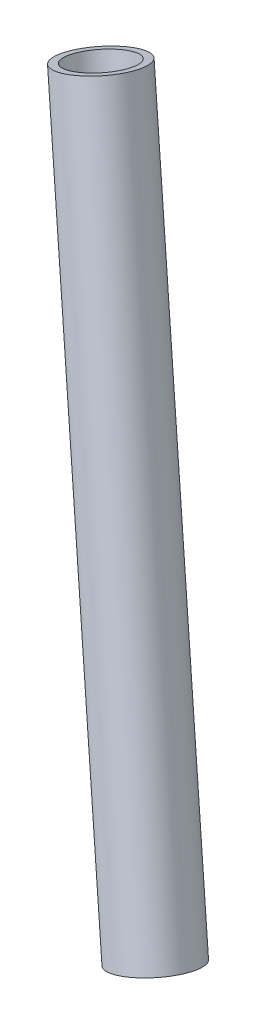
ISO-10303-21;
HEADER;
FILE_DESCRIPTION(('STEP AP214'),'2;1');
FILE_NAME('part.step','',(''),(''),'','','');
FILE_SCHEMA(('AUTOMOTIVE_DESIGN { 1 0 10303 214 1 1 1 1 }'));
ENDSEC;
DATA;
#1=APPLICATION_CONTEXT('core data for automotive mechanical design processes');
#2=APPLICATION_PROTOCOL_DEFINITION('international standard','automotive_design',2000,#1);
#3=PRODUCT_CONTEXT('',#1,'mechanical');
#4=PRODUCT('Part','Part','',(#3));
#5=PRODUCT_RELATED_PRODUCT_CATEGORY('part','',(#4));
#6=PRODUCT_DEFINITION_FORMATION('','',#4);
#7=PRODUCT_DEFINITION_CONTEXT('part definition',#1,'design');
#8=PRODUCT_DEFINITION('design','',#6,#7);
#9=PRODUCT_DEFINITION_SHAPE('','',#8);
#10=(LENGTH_UNIT() NAMED_UNIT(*) SI_UNIT(.MILLI.,.METRE.));
#11=(NAMED_UNIT(*) PLANE_ANGLE_UNIT() SI_UNIT($,.RADIAN.));
#12=(NAMED_UNIT(*) SI_UNIT($,.STERADIAN.) SOLID_ANGLE_UNIT());
#13=UNCERTAINTY_MEASURE_WITH_UNIT(LENGTH_MEASURE(1.E-05),#10,'distance_accuracy_value','');
#14=(GEOMETRIC_REPRESENTATION_CONTEXT(3) GLOBAL_UNCERTAINTY_ASSIGNED_CONTEXT((#13)) GLOBAL_UNIT_ASSIGNED_CONTEXT((#10,
#11,#12)) REPRESENTATION_CONTEXT('',''));
#15=CARTESIAN_POINT('',(0.,0.,0.));
#16=DIRECTION('',(0.,0.,1.));
#17=DIRECTION('',(1.,0.,0.));
#18=AXIS2_PLACEMENT_3D('',#15,#16,#17);
#19=CARTESIAN_POINT('',(3342.31874209923,303.316593440606,507.084670685606));
#20=DIRECTION('',(-0.273235405461771,0.942738648425643,-0.191275335489797));
#21=DIRECTION('',(-0.960472406440432,-0.278375208067322,0.));
#22=AXIS2_PLACEMENT_3D('',#19,#20,#21);
#23=CYLINDRICAL_SURFACE('',#22,13.3223000000002);
#24=CARTESIAN_POINT('',(3342.31874209923,303.316593440606,507.084670685606));
#25=DIRECTION('',(0.273235405461771,-0.942738648425643,0.191275335489797));
#26=DIRECTION('',(0.960472406440433,0.278375208067322,0.));
#27=AXIS2_PLACEMENT_3D('',#24,#25,#26);
#28=CIRCLE('',#27,13.3223000000002);
#29=CARTESIAN_POINT('',(3355.11444363955,307.025191475041,507.084670685606));
#30=VERTEX_POINT('',#29);
#31=EDGE_CURVE('E46',#30,#30,#28,.T.);
#32=ORIENTED_EDGE('',*,*,#31,.T.);
#33=EDGE_LOOP('',(#32));
#34=FACE_BOUND('',#33,.T.);
#35=CARTESIAN_POINT('',(3261.98125790077,580.503406559395,450.845329314394));
#36=DIRECTION('',(0.273235405461771,-0.942738648425643,0.191275335489797));
#37=DIRECTION('',(0.960472406440433,0.278375208067322,0.));
#38=AXIS2_PLACEMENT_3D('',#35,#36,#37);
#39=CIRCLE('',#38,13.3223000000002);
#40=CARTESIAN_POINT('',(3274.77695944109,584.21200459383,450.845329314394));
#41=VERTEX_POINT('',#40);
#42=EDGE_CURVE('E52',#41,#41,#39,.T.);
#43=ORIENTED_EDGE('',*,*,#42,.F.);
#44=EDGE_LOOP('',(#43));
#45=FACE_BOUND('',#44,.T.);
#46=ADVANCED_FACE('F39',(#34,#45),#23,.F.);
#47=CARTESIAN_POINT('',(3342.31874209923,303.316593440606,507.084670685606));
#48=DIRECTION('',(-0.273235405461771,0.942738648425643,-0.191275335489797));
#49=DIRECTION('',(-0.960472406440432,-0.278375208067322,0.));
#50=AXIS2_PLACEMENT_3D('',#47,#48,#49);
#51=CYLINDRICAL_SURFACE('',#50,16.7005000000001);
#52=CARTESIAN_POINT('',(3342.31874209923,303.316593440606,507.084670685606));
#53=DIRECTION('',(0.273235405461771,-0.942738648425643,0.191275335489797));
#54=DIRECTION('',(0.960472406440433,0.278375208067322,0.));
#55=AXIS2_PLACEMENT_3D('',#52,#53,#54);
#56=CIRCLE('',#55,16.7005000000001);
#57=CARTESIAN_POINT('',(3358.35911152299,307.965598602934,507.084670685606));
#58=VERTEX_POINT('',#57);
#59=EDGE_CURVE('E11',#58,#58,#56,.T.);
#60=ORIENTED_EDGE('',*,*,#59,.F.);
#61=EDGE_LOOP('',(#60));
#62=FACE_BOUND('',#61,.T.);
#63=CARTESIAN_POINT('',(3261.98125790077,580.503406559395,450.845329314394));
#64=DIRECTION('',(0.273235405461771,-0.942738648425643,0.191275335489797));
#65=DIRECTION('',(0.960472406440433,0.278375208067322,0.));
#66=AXIS2_PLACEMENT_3D('',#63,#64,#65);
#67=CIRCLE('',#66,16.7005000000001);
#68=CARTESIAN_POINT('',(3278.02162732453,585.152411721723,450.845329314394));
#69=VERTEX_POINT('',#68);
#70=EDGE_CURVE('E42',#69,#69,#67,.T.);
#71=ORIENTED_EDGE('',*,*,#70,.T.);
#72=EDGE_LOOP('',(#71));
#73=FACE_BOUND('',#72,.T.);
#74=ADVANCED_FACE('F59',(#62,#73),#51,.T.);
#75=CARTESIAN_POINT('',(3342.31874209923,303.316593440606,507.084670685606));
#76=DIRECTION('',(0.273235405461771,-0.942738648425643,0.191275335489797));
#77=DIRECTION('',(0.960472406440433,0.278375208067322,0.));
#78=AXIS2_PLACEMENT_3D('',#75,#76,#77);
#79=PLANE('',#78);
#80=ORIENTED_EDGE('',*,*,#31,.F.);
#81=EDGE_LOOP('',(#80));
#82=FACE_BOUND('',#81,.T.);
#83=ORIENTED_EDGE('',*,*,#59,.T.);
#84=EDGE_LOOP('',(#83));
#85=FACE_BOUND('',#84,.T.);
#86=ADVANCED_FACE('F63',(#82,#85),#79,.T.);
#87=CARTESIAN_POINT('',(3261.98125790077,580.503406559395,450.845329314394));
#88=DIRECTION('',(0.273235405461771,-0.942738648425643,0.191275335489797));
#89=DIRECTION('',(0.960472406440433,0.278375208067322,0.));
#90=AXIS2_PLACEMENT_3D('',#87,#88,#89);
#91=PLANE('',#90);
#92=ORIENTED_EDGE('',*,*,#42,.T.);
#93=EDGE_LOOP('',(#92));
#94=FACE_BOUND('',#93,.T.);
#95=ORIENTED_EDGE('',*,*,#70,.F.);
#96=EDGE_LOOP('',(#95));
#97=FACE_BOUND('',#96,.T.);
#98=ADVANCED_FACE('F61',(#94,#97),#91,.F.);
#99=CLOSED_SHELL('',(#46,#74,#86,#98));
#100=MANIFOLD_SOLID_BREP('B2',#99);
#101=ADVANCED_BREP_SHAPE_REPRESENTATION('',(#18,#100),#14);
#102=SHAPE_DEFINITION_REPRESENTATION(#9,#101);
ENDSEC;
END-ISO-10303-21;
